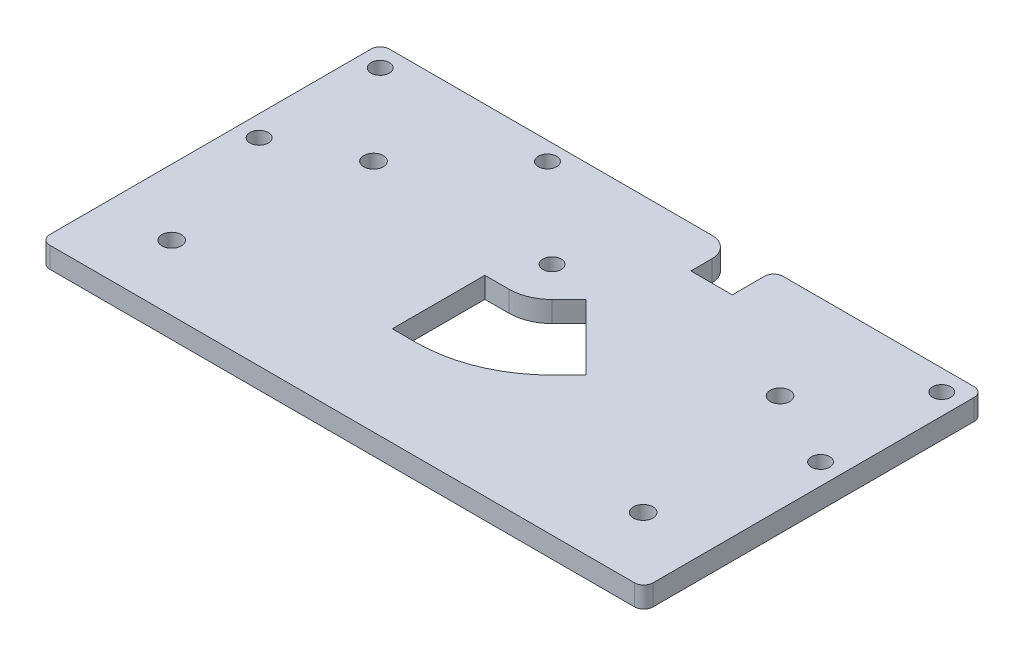
ISO-10303-21;
HEADER;
FILE_DESCRIPTION(('STEP AP214'),'2;1');
FILE_NAME('part.step','',(''),(''),'','','');
FILE_SCHEMA(('AUTOMOTIVE_DESIGN { 1 0 10303 214 1 1 1 1 }'));
ENDSEC;
DATA;
#1=APPLICATION_CONTEXT('core data for automotive mechanical design processes');
#2=APPLICATION_PROTOCOL_DEFINITION('international standard','automotive_design',2000,#1);
#3=PRODUCT_CONTEXT('',#1,'mechanical');
#4=PRODUCT('Part','Part','',(#3));
#5=PRODUCT_RELATED_PRODUCT_CATEGORY('part','',(#4));
#6=PRODUCT_DEFINITION_FORMATION('','',#4);
#7=PRODUCT_DEFINITION_CONTEXT('part definition',#1,'design');
#8=PRODUCT_DEFINITION('design','',#6,#7);
#9=PRODUCT_DEFINITION_SHAPE('','',#8);
#10=(LENGTH_UNIT() NAMED_UNIT(*) SI_UNIT(.MILLI.,.METRE.));
#11=(NAMED_UNIT(*) PLANE_ANGLE_UNIT() SI_UNIT($,.RADIAN.));
#12=(NAMED_UNIT(*) SI_UNIT($,.STERADIAN.) SOLID_ANGLE_UNIT());
#13=UNCERTAINTY_MEASURE_WITH_UNIT(LENGTH_MEASURE(1.E-05),#10,'distance_accuracy_value','');
#14=(GEOMETRIC_REPRESENTATION_CONTEXT(3) GLOBAL_UNCERTAINTY_ASSIGNED_CONTEXT((#13)) GLOBAL_UNIT_ASSIGNED_CONTEXT((#10,
#11,#12)) REPRESENTATION_CONTEXT('',''));
#15=CARTESIAN_POINT('',(0.,0.,0.));
#16=DIRECTION('',(0.,0.,1.));
#17=DIRECTION('',(1.,0.,0.));
#18=AXIS2_PLACEMENT_3D('',#15,#16,#17);
#19=CARTESIAN_POINT('',(6.51999999999997,4.5,-15.95));
#20=DIRECTION('',(0.,1.,0.));
#21=DIRECTION('',(0.,0.,1.));
#22=AXIS2_PLACEMENT_3D('',#19,#20,#21);
#23=PLANE('',#22);
#24=DIRECTION('',(0.707106781186538,0.,-0.707106781186557));
#25=VECTOR('',#24,1.);
#26=CARTESIAN_POINT('',(15.354548507695,4.5,23.0225248741374));
#27=LINE('',#26,#25);
#28=CARTESIAN_POINT('',(15.354548507695,4.5,23.0225248741374));
#29=VERTEX_POINT('',#28);
#30=CARTESIAN_POINT('',(19.0173616342414,4.5,19.359711747591));
#31=VERTEX_POINT('',#30);
#32=EDGE_CURVE('E190',#29,#31,#27,.T.);
#33=ORIENTED_EDGE('',*,*,#32,.F.);
#34=CARTESIAN_POINT('',(-5.32832484201151,4.5,2.33965152443094));
#35=DIRECTION('',(0.,1.,0.));
#36=DIRECTION('',(0.,0.,1.));
#37=AXIS2_PLACEMENT_3D('',#34,#35,#36);
#38=CIRCLE('',#37,29.25);
#39=CARTESIAN_POINT('',(-5.32832484201151,4.5,31.5896515244309));
#40=VERTEX_POINT('',#39);
#41=EDGE_CURVE('E182',#40,#29,#38,.T.);
#42=ORIENTED_EDGE('',*,*,#41,.F.);
#43=DIRECTION('',(1.,0.,0.));
#44=VECTOR('',#43,1.);
#45=CARTESIAN_POINT('',(-5.32832484201151,4.5,31.5896515244309));
#46=LINE('',#45,#44);
#47=CARTESIAN_POINT('',(-10.5083248420115,4.5,31.5896515244309));
#48=VERTEX_POINT('',#47);
#49=EDGE_CURVE('E217',#48,#40,#46,.T.);
#50=ORIENTED_EDGE('',*,*,#49,.F.);
#51=DIRECTION('',(0.000154902687349206,0.,0.999999988002579));
#52=VECTOR('',#51,1.);
#53=CARTESIAN_POINT('',(-10.5114166996881,4.5,11.6296515244309));
#54=LINE('',#53,#52);
#55=CARTESIAN_POINT('',(-10.5114166996881,4.5,11.6296515244309));
#56=VERTEX_POINT('',#55);
#57=EDGE_CURVE('E215',#56,#48,#54,.T.);
#58=ORIENTED_EDGE('',*,*,#57,.F.);
#59=DIRECTION('',(-1.,0.,0.));
#60=VECTOR('',#59,1.);
#61=CARTESIAN_POINT('',(-5.32832484201151,4.5,11.6296515244309));
#62=LINE('',#61,#60);
#63=CARTESIAN_POINT('',(-5.32832484201151,4.5,11.6296515244309));
#64=VERTEX_POINT('',#63);
#65=EDGE_CURVE('E213',#64,#56,#62,.T.);
#66=ORIENTED_EDGE('',*,*,#65,.F.);
#67=CARTESIAN_POINT('',(-5.32832484201151,4.5,2.33965152443094));
#68=DIRECTION('',(0.,-1.,0.));
#69=DIRECTION('',(0.,0.,1.));
#70=AXIS2_PLACEMENT_3D('',#67,#68,#69);
#71=CIRCLE('',#70,9.29);
#72=CARTESIAN_POINT('',(1.24069715521153,4.5,8.90867352165396));
#73=VERTEX_POINT('',#72);
#74=EDGE_CURVE('E211',#73,#64,#71,.T.);
#75=ORIENTED_EDGE('',*,*,#74,.F.);
#76=DIRECTION('',(-0.707106781186546,0.,0.707106781186549));
#77=VECTOR('',#76,1.);
#78=CARTESIAN_POINT('',(1.24069715521153,4.5,8.90867352165396));
#79=LINE('',#78,#77);
#80=CARTESIAN_POINT('',(4.90351028175794,4.5,5.24586039510753));
#81=VERTEX_POINT('',#80);
#82=EDGE_CURVE('E206',#81,#73,#79,.T.);
#83=ORIENTED_EDGE('',*,*,#82,.F.);
#84=DIRECTION('',(-0.707106781186548,0.,-0.707106781186548));
#85=VECTOR('',#84,1.);
#86=CARTESIAN_POINT('',(4.90351028175794,4.5,5.24586039510753));
#87=LINE('',#86,#85);
#88=EDGE_CURVE('E204',#31,#81,#87,.T.);
#89=ORIENTED_EDGE('',*,*,#88,.F.);
#90=EDGE_LOOP('',(#33,#42,#50,#58,#66,#75,#83,#89));
#91=FACE_BOUND('',#90,.T.);
#92=CARTESIAN_POINT('',(-43.8023,4.5,2.33965152443094));
#93=DIRECTION('',(0.,1.,0.));
#94=DIRECTION('',(0.,0.,1.));
#95=AXIS2_PLACEMENT_3D('',#92,#93,#94);
#96=CIRCLE('',#95,2.1082);
#97=CARTESIAN_POINT('',(-43.8023,4.5,4.44785152443094));
#98=VERTEX_POINT('',#97);
#99=EDGE_CURVE('E256',#98,#98,#96,.T.);
#100=ORIENTED_EDGE('',*,*,#99,.F.);
#101=EDGE_LOOP('',(#100));
#102=FACE_BOUND('',#101,.T.);
#103=CARTESIAN_POINT('',(-5.32832484201151,4.5,2.33965152443094));
#104=DIRECTION('',(0.,1.,0.));
#105=DIRECTION('',(0.,0.,1.));
#106=AXIS2_PLACEMENT_3D('',#103,#104,#105);
#107=CIRCLE('',#106,1.975);
#108=CARTESIAN_POINT('',(-5.32832484201151,4.5,4.31465152443094));
#109=VERTEX_POINT('',#108);
#110=EDGE_CURVE('E268',#109,#109,#107,.T.);
#111=ORIENTED_EDGE('',*,*,#110,.F.);
#112=EDGE_LOOP('',(#111));
#113=FACE_BOUND('',#112,.T.);
#114=CARTESIAN_POINT('',(-60.5,4.5,10.3));
#115=DIRECTION('',(0.,1.,0.));
#116=DIRECTION('',(0.,0.,-1.));
#117=AXIS2_PLACEMENT_3D('',#114,#115,#116);
#118=CIRCLE('',#117,1.975);
#119=CARTESIAN_POINT('',(-60.5,4.5,8.32500000000002));
#120=VERTEX_POINT('',#119);
#121=EDGE_CURVE('E280',#120,#120,#118,.T.);
#122=ORIENTED_EDGE('',*,*,#121,.F.);
#123=EDGE_LOOP('',(#122));
#124=FACE_BOUND('',#123,.T.);
#125=CARTESIAN_POINT('',(60.5,4.5,-15.8));
#126=DIRECTION('',(0.,1.,0.));
#127=DIRECTION('',(0.,0.,-1.));
#128=AXIS2_PLACEMENT_3D('',#125,#126,#127);
#129=CIRCLE('',#128,1.975);
#130=CARTESIAN_POINT('',(60.5,4.5,-17.775));
#131=VERTEX_POINT('',#130);
#132=EDGE_CURVE('E292',#131,#131,#129,.T.);
#133=ORIENTED_EDGE('',*,*,#132,.F.);
#134=EDGE_LOOP('',(#133));
#135=FACE_BOUND('',#134,.T.);
#136=DIRECTION('',(0.,0.,1.));
#137=VECTOR('',#136,1.);
#138=CARTESIAN_POINT('',(19.8,4.5,-18.3));
#139=LINE('',#138,#137);
#140=CARTESIAN_POINT('',(19.8,4.5,-18.3));
#141=VERTEX_POINT('',#140);
#142=CARTESIAN_POINT('',(19.8,4.5,-11.37));
#143=VERTEX_POINT('',#142);
#144=EDGE_CURVE('E304',#141,#143,#139,.T.);
#145=ORIENTED_EDGE('',*,*,#144,.T.);
#146=DIRECTION('',(-1.,0.,0.));
#147=VECTOR('',#146,1.);
#148=CARTESIAN_POINT('',(10.87,4.5,-11.37));
#149=LINE('',#148,#147);
#150=CARTESIAN_POINT('',(10.87,4.5,-11.37));
#151=VERTEX_POINT('',#150);
#152=EDGE_CURVE('E307',#143,#151,#149,.T.);
#153=ORIENTED_EDGE('',*,*,#152,.T.);
#154=DIRECTION('',(0.,0.,-1.));
#155=VECTOR('',#154,1.);
#156=CARTESIAN_POINT('',(10.87,4.5,-15.95));
#157=LINE('',#156,#155);
#158=CARTESIAN_POINT('',(10.87,4.5,-15.95));
#159=VERTEX_POINT('',#158);
#160=EDGE_CURVE('E310',#151,#159,#157,.T.);
#161=ORIENTED_EDGE('',*,*,#160,.T.);
#162=CARTESIAN_POINT('',(6.51999999999997,4.5,-15.95));
#163=DIRECTION('',(0.,1.,0.));
#164=DIRECTION('',(0.,0.,1.));
#165=AXIS2_PLACEMENT_3D('',#162,#163,#164);
#166=CIRCLE('',#165,4.35);
#167=CARTESIAN_POINT('',(6.51999999999997,4.5,-20.3));
#168=VERTEX_POINT('',#167);
#169=EDGE_CURVE('E312',#159,#168,#166,.T.);
#170=ORIENTED_EDGE('',*,*,#169,.T.);
#171=DIRECTION('',(-1.,0.,0.));
#172=VECTOR('',#171,1.);
#173=CARTESIAN_POINT('',(6.51999999999997,4.5,-20.3));
#174=LINE('',#173,#172);
#175=CARTESIAN_POINT('',(-63.,4.5,-20.3));
#176=VERTEX_POINT('',#175);
#177=EDGE_CURVE('E314',#168,#176,#174,.T.);
#178=ORIENTED_EDGE('',*,*,#177,.T.);
#179=CARTESIAN_POINT('',(-63.,4.5,-18.3));
#180=DIRECTION('',(0.,1.,0.));
#181=DIRECTION('',(0.,0.,1.));
#182=AXIS2_PLACEMENT_3D('',#179,#180,#181);
#183=CIRCLE('',#182,2.);
#184=CARTESIAN_POINT('',(-65.,4.5,-18.3));
#185=VERTEX_POINT('',#184);
#186=EDGE_CURVE('E316',#176,#185,#183,.T.);
#187=ORIENTED_EDGE('',*,*,#186,.T.);
#188=DIRECTION('',(0.,0.,1.));
#189=VECTOR('',#188,1.);
#190=CARTESIAN_POINT('',(-65.,4.5,-18.3));
#191=LINE('',#190,#189);
#192=CARTESIAN_POINT('',(-65.,4.5,50.9));
#193=VERTEX_POINT('',#192);
#194=EDGE_CURVE('E318',#185,#193,#191,.T.);
#195=ORIENTED_EDGE('',*,*,#194,.T.);
#196=CARTESIAN_POINT('',(-63.,4.5,50.9));
#197=DIRECTION('',(0.,1.,0.));
#198=DIRECTION('',(0.,0.,-1.));
#199=AXIS2_PLACEMENT_3D('',#196,#197,#198);
#200=CIRCLE('',#199,2.);
#201=CARTESIAN_POINT('',(-63.,4.5,52.9));
#202=VERTEX_POINT('',#201);
#203=EDGE_CURVE('E320',#193,#202,#200,.T.);
#204=ORIENTED_EDGE('',*,*,#203,.T.);
#205=DIRECTION('',(1.,0.,0.));
#206=VECTOR('',#205,1.);
#207=CARTESIAN_POINT('',(63.,4.5,52.8999999999999));
#208=LINE('',#207,#206);
#209=CARTESIAN_POINT('',(63.,4.5,52.8999999999999));
#210=VERTEX_POINT('',#209);
#211=EDGE_CURVE('E322',#202,#210,#208,.T.);
#212=ORIENTED_EDGE('',*,*,#211,.T.);
#213=CARTESIAN_POINT('',(63.,4.5,50.8999999999999));
#214=DIRECTION('',(0.,1.,0.));
#215=DIRECTION('',(0.,0.,-1.));
#216=AXIS2_PLACEMENT_3D('',#213,#214,#215);
#217=CIRCLE('',#216,2.);
#218=CARTESIAN_POINT('',(65.,4.5,50.8999999999999));
#219=VERTEX_POINT('',#218);
#220=EDGE_CURVE('E324',#210,#219,#217,.T.);
#221=ORIENTED_EDGE('',*,*,#220,.T.);
#222=DIRECTION('',(0.,0.,-1.));
#223=VECTOR('',#222,1.);
#224=CARTESIAN_POINT('',(65.,4.5,-18.3));
#225=LINE('',#224,#223);
#226=CARTESIAN_POINT('',(65.,4.5,-18.3));
#227=VERTEX_POINT('',#226);
#228=EDGE_CURVE('E326',#219,#227,#225,.T.);
#229=ORIENTED_EDGE('',*,*,#228,.T.);
#230=CARTESIAN_POINT('',(63.,4.5,-18.3));
#231=DIRECTION('',(0.,1.,0.));
#232=DIRECTION('',(0.,0.,-1.));
#233=AXIS2_PLACEMENT_3D('',#230,#231,#232);
#234=CIRCLE('',#233,2.);
#235=CARTESIAN_POINT('',(63.,4.5,-20.3));
#236=VERTEX_POINT('',#235);
#237=EDGE_CURVE('E328',#227,#236,#234,.T.);
#238=ORIENTED_EDGE('',*,*,#237,.T.);
#239=DIRECTION('',(-1.,0.,0.));
#240=VECTOR('',#239,1.);
#241=CARTESIAN_POINT('',(63.,4.5,-20.3));
#242=LINE('',#241,#240);
#243=CARTESIAN_POINT('',(21.8,4.5,-20.3));
#244=VERTEX_POINT('',#243);
#245=EDGE_CURVE('E330',#236,#244,#242,.T.);
#246=ORIENTED_EDGE('',*,*,#245,.T.);
#247=CARTESIAN_POINT('',(21.8,4.5,-18.3));
#248=DIRECTION('',(0.,1.,0.));
#249=DIRECTION('',(0.,0.,1.));
#250=AXIS2_PLACEMENT_3D('',#247,#248,#249);
#251=CIRCLE('',#250,2.00000000000002);
#252=EDGE_CURVE('E332',#244,#141,#251,.T.);
#253=ORIENTED_EDGE('',*,*,#252,.T.);
#254=EDGE_LOOP('',(#145,#153,#161,#170,#178,#187,#195,#204,#212,#221,#229,#238,#246,#253));
#255=FACE_BOUND('',#254,.T.);
#256=CARTESIAN_POINT('',(-60.5,4.5,-15.8));
#257=DIRECTION('',(0.,1.,0.));
#258=DIRECTION('',(0.,0.,1.));
#259=AXIS2_PLACEMENT_3D('',#256,#257,#258);
#260=CIRCLE('',#259,1.97499999999998);
#261=CARTESIAN_POINT('',(-60.5,4.5,-13.825));
#262=VERTEX_POINT('',#261);
#263=EDGE_CURVE('E298',#262,#262,#260,.T.);
#264=ORIENTED_EDGE('',*,*,#263,.F.);
#265=EDGE_LOOP('',(#264));
#266=FACE_BOUND('',#265,.T.);
#267=CARTESIAN_POINT('',(60.5,4.5,10.3));
#268=DIRECTION('',(0.,1.,0.));
#269=DIRECTION('',(0.,0.,1.));
#270=AXIS2_PLACEMENT_3D('',#267,#268,#269);
#271=CIRCLE('',#270,1.975);
#272=CARTESIAN_POINT('',(60.5,4.5,12.275));
#273=VERTEX_POINT('',#272);
#274=EDGE_CURVE('E286',#273,#273,#271,.T.);
#275=ORIENTED_EDGE('',*,*,#274,.F.);
#276=EDGE_LOOP('',(#275));
#277=FACE_BOUND('',#276,.T.);
#278=CARTESIAN_POINT('',(-25.0042608190786,4.5,-16.35));
#279=DIRECTION('',(0.,1.,0.));
#280=DIRECTION('',(0.,0.,1.));
#281=AXIS2_PLACEMENT_3D('',#278,#279,#280);
#282=CIRCLE('',#281,1.97499999999998);
#283=CARTESIAN_POINT('',(-25.0042608190786,4.5,-14.375));
#284=VERTEX_POINT('',#283);
#285=EDGE_CURVE('E274',#284,#284,#282,.T.);
#286=ORIENTED_EDGE('',*,*,#285,.F.);
#287=EDGE_LOOP('',(#286));
#288=FACE_BOUND('',#287,.T.);
#289=CARTESIAN_POINT('',(-50.8,4.5,38.838722529222));
#290=DIRECTION('',(0.,1.,0.));
#291=DIRECTION('',(0.,0.,1.));
#292=AXIS2_PLACEMENT_3D('',#289,#290,#291);
#293=CIRCLE('',#292,2.10819999999999);
#294=CARTESIAN_POINT('',(-50.8,4.5,40.946922529222));
#295=VERTEX_POINT('',#294);
#296=EDGE_CURVE('E262',#295,#295,#293,.T.);
#297=ORIENTED_EDGE('',*,*,#296,.F.);
#298=EDGE_LOOP('',(#297));
#299=FACE_BOUND('',#298,.T.);
#300=CARTESIAN_POINT('',(43.8023,4.5,2.33965152443093));
#301=DIRECTION('',(0.,1.,0.));
#302=DIRECTION('',(0.,0.,-1.));
#303=AXIS2_PLACEMENT_3D('',#300,#301,#302);
#304=CIRCLE('',#303,2.1082);
#305=CARTESIAN_POINT('',(43.8023,4.5,0.231451524430932));
#306=VERTEX_POINT('',#305);
#307=EDGE_CURVE('E250',#306,#306,#304,.T.);
#308=ORIENTED_EDGE('',*,*,#307,.F.);
#309=EDGE_LOOP('',(#308));
#310=FACE_BOUND('',#309,.T.);
#311=CARTESIAN_POINT('',(50.8,4.5,38.838722529222));
#312=DIRECTION('',(0.,1.,0.));
#313=DIRECTION('',(0.,0.,-1.));
#314=AXIS2_PLACEMENT_3D('',#311,#312,#313);
#315=CIRCLE('',#314,2.10819999999999);
#316=CARTESIAN_POINT('',(50.8,4.5,36.730522529222));
#317=VERTEX_POINT('',#316);
#318=EDGE_CURVE('E220',#317,#317,#315,.T.);
#319=ORIENTED_EDGE('',*,*,#318,.F.);
#320=EDGE_LOOP('',(#319));
#321=FACE_BOUND('',#320,.T.);
#322=ADVANCED_FACE('F33',(#91,#102,#113,#124,#135,#255,#266,#277,#288,#299,#310,#321),#23,.T.);
#323=CARTESIAN_POINT('',(6.51999999999997,0.,-15.95));
#324=DIRECTION('',(0.,1.,0.));
#325=DIRECTION('',(0.,0.,1.));
#326=AXIS2_PLACEMENT_3D('',#323,#324,#325);
#327=PLANE('',#326);
#328=CARTESIAN_POINT('',(-5.32832484201151,0.,2.33965152443094));
#329=DIRECTION('',(0.,1.,0.));
#330=DIRECTION('',(0.,0.,1.));
#331=AXIS2_PLACEMENT_3D('',#328,#329,#330);
#332=CIRCLE('',#331,29.25);
#333=CARTESIAN_POINT('',(-5.32832484201151,0.,31.5896515244309));
#334=VERTEX_POINT('',#333);
#335=CARTESIAN_POINT('',(15.354548507695,0.,23.0225248741374));
#336=VERTEX_POINT('',#335);
#337=EDGE_CURVE('E56',#334,#336,#332,.T.);
#338=ORIENTED_EDGE('',*,*,#337,.T.);
#339=DIRECTION('',(0.707106781186538,0.,-0.707106781186557));
#340=VECTOR('',#339,1.);
#341=CARTESIAN_POINT('',(15.354548507695,0.,23.0225248741374));
#342=LINE('',#341,#340);
#343=CARTESIAN_POINT('',(19.0173616342414,0.,19.359711747591));
#344=VERTEX_POINT('',#343);
#345=EDGE_CURVE('E197',#336,#344,#342,.T.);
#346=ORIENTED_EDGE('',*,*,#345,.T.);
#347=DIRECTION('',(-0.707106781186548,0.,-0.707106781186548));
#348=VECTOR('',#347,1.);
#349=CARTESIAN_POINT('',(4.90351028175794,0.,5.24586039510753));
#350=LINE('',#349,#348);
#351=CARTESIAN_POINT('',(4.90351028175794,0.,5.24586039510753));
#352=VERTEX_POINT('',#351);
#353=EDGE_CURVE('E222',#344,#352,#350,.T.);
#354=ORIENTED_EDGE('',*,*,#353,.T.);
#355=DIRECTION('',(-0.707106781186546,0.,0.707106781186549));
#356=VECTOR('',#355,1.);
#357=CARTESIAN_POINT('',(1.24069715521153,0.,8.90867352165396));
#358=LINE('',#357,#356);
#359=CARTESIAN_POINT('',(1.24069715521153,0.,8.90867352165396));
#360=VERTEX_POINT('',#359);
#361=EDGE_CURVE('E225',#352,#360,#358,.T.);
#362=ORIENTED_EDGE('',*,*,#361,.T.);
#363=CARTESIAN_POINT('',(-5.32832484201151,0.,2.33965152443094));
#364=DIRECTION('',(0.,-1.,0.));
#365=DIRECTION('',(0.,0.,1.));
#366=AXIS2_PLACEMENT_3D('',#363,#364,#365);
#367=CIRCLE('',#366,9.29);
#368=CARTESIAN_POINT('',(-5.32832484201151,0.,11.6296515244309));
#369=VERTEX_POINT('',#368);
#370=EDGE_CURVE('E228',#360,#369,#367,.T.);
#371=ORIENTED_EDGE('',*,*,#370,.T.);
#372=DIRECTION('',(-1.,0.,0.));
#373=VECTOR('',#372,1.);
#374=CARTESIAN_POINT('',(-5.32832484201151,0.,11.6296515244309));
#375=LINE('',#374,#373);
#376=CARTESIAN_POINT('',(-10.5114166996881,0.,11.6296515244309));
#377=VERTEX_POINT('',#376);
#378=EDGE_CURVE('E231',#369,#377,#375,.T.);
#379=ORIENTED_EDGE('',*,*,#378,.T.);
#380=DIRECTION('',(0.000154902687349206,0.,0.999999988002579));
#381=VECTOR('',#380,1.);
#382=CARTESIAN_POINT('',(-10.5114166996881,0.,11.6296515244309));
#383=LINE('',#382,#381);
#384=CARTESIAN_POINT('',(-10.5083248420115,0.,31.5896515244309));
#385=VERTEX_POINT('',#384);
#386=EDGE_CURVE('E234',#377,#385,#383,.T.);
#387=ORIENTED_EDGE('',*,*,#386,.T.);
#388=DIRECTION('',(1.,0.,0.));
#389=VECTOR('',#388,1.);
#390=CARTESIAN_POINT('',(-5.32832484201151,0.,31.5896515244309));
#391=LINE('',#390,#389);
#392=EDGE_CURVE('E191',#385,#334,#391,.T.);
#393=ORIENTED_EDGE('',*,*,#392,.T.);
#394=EDGE_LOOP('',(#338,#346,#354,#362,#371,#379,#387,#393));
#395=FACE_BOUND('',#394,.T.);
#396=CARTESIAN_POINT('',(-43.8023,0.,2.33965152443094));
#397=DIRECTION('',(0.,1.,0.));
#398=DIRECTION('',(0.,0.,1.));
#399=AXIS2_PLACEMENT_3D('',#396,#397,#398);
#400=CIRCLE('',#399,2.1082);
#401=CARTESIAN_POINT('',(-43.8023,0.,4.44785152443094));
#402=VERTEX_POINT('',#401);
#403=EDGE_CURVE('E253',#402,#402,#400,.T.);
#404=ORIENTED_EDGE('',*,*,#403,.T.);
#405=EDGE_LOOP('',(#404));
#406=FACE_BOUND('',#405,.T.);
#407=CARTESIAN_POINT('',(-5.32832484201151,0.,2.33965152443094));
#408=DIRECTION('',(0.,1.,0.));
#409=DIRECTION('',(0.,0.,1.));
#410=AXIS2_PLACEMENT_3D('',#407,#408,#409);
#411=CIRCLE('',#410,1.975);
#412=CARTESIAN_POINT('',(-5.32832484201151,0.,4.31465152443094));
#413=VERTEX_POINT('',#412);
#414=EDGE_CURVE('E265',#413,#413,#411,.T.);
#415=ORIENTED_EDGE('',*,*,#414,.T.);
#416=EDGE_LOOP('',(#415));
#417=FACE_BOUND('',#416,.T.);
#418=CARTESIAN_POINT('',(-60.5,0.,10.3));
#419=DIRECTION('',(0.,1.,0.));
#420=DIRECTION('',(0.,0.,-1.));
#421=AXIS2_PLACEMENT_3D('',#418,#419,#420);
#422=CIRCLE('',#421,1.975);
#423=CARTESIAN_POINT('',(-60.5,0.,8.32500000000002));
#424=VERTEX_POINT('',#423);
#425=EDGE_CURVE('E277',#424,#424,#422,.T.);
#426=ORIENTED_EDGE('',*,*,#425,.T.);
#427=EDGE_LOOP('',(#426));
#428=FACE_BOUND('',#427,.T.);
#429=CARTESIAN_POINT('',(60.5,0.,-15.8));
#430=DIRECTION('',(0.,1.,0.));
#431=DIRECTION('',(0.,0.,-1.));
#432=AXIS2_PLACEMENT_3D('',#429,#430,#431);
#433=CIRCLE('',#432,1.975);
#434=CARTESIAN_POINT('',(60.5,0.,-17.775));
#435=VERTEX_POINT('',#434);
#436=EDGE_CURVE('E289',#435,#435,#433,.T.);
#437=ORIENTED_EDGE('',*,*,#436,.T.);
#438=EDGE_LOOP('',(#437));
#439=FACE_BOUND('',#438,.T.);
#440=DIRECTION('',(0.,0.,1.));
#441=VECTOR('',#440,1.);
#442=CARTESIAN_POINT('',(19.8,0.,-18.3));
#443=LINE('',#442,#441);
#444=CARTESIAN_POINT('',(19.8,0.,-18.3));
#445=VERTEX_POINT('',#444);
#446=CARTESIAN_POINT('',(19.8,0.,-11.37));
#447=VERTEX_POINT('',#446);
#448=EDGE_CURVE('E301',#445,#447,#443,.T.);
#449=ORIENTED_EDGE('',*,*,#448,.F.);
#450=CARTESIAN_POINT('',(21.8,0.,-18.3));
#451=DIRECTION('',(0.,1.,0.));
#452=DIRECTION('',(0.,0.,1.));
#453=AXIS2_PLACEMENT_3D('',#450,#451,#452);
#454=CIRCLE('',#453,2.00000000000002);
#455=CARTESIAN_POINT('',(21.8,0.,-20.3));
#456=VERTEX_POINT('',#455);
#457=EDGE_CURVE('E308',#456,#445,#454,.T.);
#458=ORIENTED_EDGE('',*,*,#457,.F.);
#459=DIRECTION('',(-1.,0.,0.));
#460=VECTOR('',#459,1.);
#461=CARTESIAN_POINT('',(63.,0.,-20.3));
#462=LINE('',#461,#460);
#463=CARTESIAN_POINT('',(63.,0.,-20.3));
#464=VERTEX_POINT('',#463);
#465=EDGE_CURVE('E359',#464,#456,#462,.T.);
#466=ORIENTED_EDGE('',*,*,#465,.F.);
#467=CARTESIAN_POINT('',(63.,0.,-18.3));
#468=DIRECTION('',(0.,1.,0.));
#469=DIRECTION('',(0.,0.,-1.));
#470=AXIS2_PLACEMENT_3D('',#467,#468,#469);
#471=CIRCLE('',#470,2.);
#472=CARTESIAN_POINT('',(65.,0.,-18.3));
#473=VERTEX_POINT('',#472);
#474=EDGE_CURVE('E357',#473,#464,#471,.T.);
#475=ORIENTED_EDGE('',*,*,#474,.F.);
#476=DIRECTION('',(0.,0.,-1.));
#477=VECTOR('',#476,1.);
#478=CARTESIAN_POINT('',(65.,0.,-18.3));
#479=LINE('',#478,#477);
#480=CARTESIAN_POINT('',(65.,0.,50.8999999999999));
#481=VERTEX_POINT('',#480);
#482=EDGE_CURVE('E355',#481,#473,#479,.T.);
#483=ORIENTED_EDGE('',*,*,#482,.F.);
#484=CARTESIAN_POINT('',(63.,0.,50.8999999999999));
#485=DIRECTION('',(0.,1.,0.));
#486=DIRECTION('',(0.,0.,-1.));
#487=AXIS2_PLACEMENT_3D('',#484,#485,#486);
#488=CIRCLE('',#487,2.);
#489=CARTESIAN_POINT('',(63.,0.,52.8999999999999));
#490=VERTEX_POINT('',#489);
#491=EDGE_CURVE('E353',#490,#481,#488,.T.);
#492=ORIENTED_EDGE('',*,*,#491,.F.);
#493=DIRECTION('',(1.,0.,0.));
#494=VECTOR('',#493,1.);
#495=CARTESIAN_POINT('',(63.,0.,52.8999999999999));
#496=LINE('',#495,#494);
#497=CARTESIAN_POINT('',(-63.,0.,52.9));
#498=VERTEX_POINT('',#497);
#499=EDGE_CURVE('E351',#498,#490,#496,.T.);
#500=ORIENTED_EDGE('',*,*,#499,.F.);
#501=CARTESIAN_POINT('',(-63.,0.,50.9));
#502=DIRECTION('',(0.,1.,0.));
#503=DIRECTION('',(0.,0.,-1.));
#504=AXIS2_PLACEMENT_3D('',#501,#502,#503);
#505=CIRCLE('',#504,2.);
#506=CARTESIAN_POINT('',(-65.,0.,50.9));
#507=VERTEX_POINT('',#506);
#508=EDGE_CURVE('E349',#507,#498,#505,.T.);
#509=ORIENTED_EDGE('',*,*,#508,.F.);
#510=DIRECTION('',(0.,0.,1.));
#511=VECTOR('',#510,1.);
#512=CARTESIAN_POINT('',(-65.,0.,-18.3));
#513=LINE('',#512,#511);
#514=CARTESIAN_POINT('',(-65.,0.,-18.3));
#515=VERTEX_POINT('',#514);
#516=EDGE_CURVE('E347',#515,#507,#513,.T.);
#517=ORIENTED_EDGE('',*,*,#516,.F.);
#518=CARTESIAN_POINT('',(-63.,0.,-18.3));
#519=DIRECTION('',(0.,1.,0.));
#520=DIRECTION('',(0.,0.,1.));
#521=AXIS2_PLACEMENT_3D('',#518,#519,#520);
#522=CIRCLE('',#521,2.);
#523=CARTESIAN_POINT('',(-63.,0.,-20.3));
#524=VERTEX_POINT('',#523);
#525=EDGE_CURVE('E345',#524,#515,#522,.T.);
#526=ORIENTED_EDGE('',*,*,#525,.F.);
#527=DIRECTION('',(-1.,0.,0.));
#528=VECTOR('',#527,1.);
#529=CARTESIAN_POINT('',(6.51999999999997,0.,-20.3));
#530=LINE('',#529,#528);
#531=CARTESIAN_POINT('',(6.51999999999997,0.,-20.3));
#532=VERTEX_POINT('',#531);
#533=EDGE_CURVE('E343',#532,#524,#530,.T.);
#534=ORIENTED_EDGE('',*,*,#533,.F.);
#535=CARTESIAN_POINT('',(6.51999999999997,0.,-15.95));
#536=DIRECTION('',(0.,1.,0.));
#537=DIRECTION('',(0.,0.,1.));
#538=AXIS2_PLACEMENT_3D('',#535,#536,#537);
#539=CIRCLE('',#538,4.35);
#540=CARTESIAN_POINT('',(10.87,0.,-15.95));
#541=VERTEX_POINT('',#540);
#542=EDGE_CURVE('E341',#541,#532,#539,.T.);
#543=ORIENTED_EDGE('',*,*,#542,.F.);
#544=DIRECTION('',(0.,0.,-1.));
#545=VECTOR('',#544,1.);
#546=CARTESIAN_POINT('',(10.87,0.,-15.95));
#547=LINE('',#546,#545);
#548=CARTESIAN_POINT('',(10.87,0.,-11.37));
#549=VERTEX_POINT('',#548);
#550=EDGE_CURVE('E339',#549,#541,#547,.T.);
#551=ORIENTED_EDGE('',*,*,#550,.F.);
#552=DIRECTION('',(-1.,0.,0.));
#553=VECTOR('',#552,1.);
#554=CARTESIAN_POINT('',(10.87,0.,-11.37));
#555=LINE('',#554,#553);
#556=EDGE_CURVE('E337',#447,#549,#555,.T.);
#557=ORIENTED_EDGE('',*,*,#556,.F.);
#558=EDGE_LOOP('',(#449,#458,#466,#475,#483,#492,#500,#509,#517,#526,#534,#543,#551,#557));
#559=FACE_BOUND('',#558,.T.);
#560=CARTESIAN_POINT('',(-60.5,0.,-15.8));
#561=DIRECTION('',(0.,1.,0.));
#562=DIRECTION('',(0.,0.,1.));
#563=AXIS2_PLACEMENT_3D('',#560,#561,#562);
#564=CIRCLE('',#563,1.97499999999998);
#565=CARTESIAN_POINT('',(-60.5,0.,-13.825));
#566=VERTEX_POINT('',#565);
#567=EDGE_CURVE('E295',#566,#566,#564,.T.);
#568=ORIENTED_EDGE('',*,*,#567,.T.);
#569=EDGE_LOOP('',(#568));
#570=FACE_BOUND('',#569,.T.);
#571=CARTESIAN_POINT('',(60.5,0.,10.3));
#572=DIRECTION('',(0.,1.,0.));
#573=DIRECTION('',(0.,0.,1.));
#574=AXIS2_PLACEMENT_3D('',#571,#572,#573);
#575=CIRCLE('',#574,1.975);
#576=CARTESIAN_POINT('',(60.5,0.,12.275));
#577=VERTEX_POINT('',#576);
#578=EDGE_CURVE('E283',#577,#577,#575,.T.);
#579=ORIENTED_EDGE('',*,*,#578,.T.);
#580=EDGE_LOOP('',(#579));
#581=FACE_BOUND('',#580,.T.);
#582=CARTESIAN_POINT('',(-25.0042608190786,0.,-16.35));
#583=DIRECTION('',(0.,1.,0.));
#584=DIRECTION('',(0.,0.,1.));
#585=AXIS2_PLACEMENT_3D('',#582,#583,#584);
#586=CIRCLE('',#585,1.97499999999998);
#587=CARTESIAN_POINT('',(-25.0042608190786,0.,-14.375));
#588=VERTEX_POINT('',#587);
#589=EDGE_CURVE('E271',#588,#588,#586,.T.);
#590=ORIENTED_EDGE('',*,*,#589,.T.);
#591=EDGE_LOOP('',(#590));
#592=FACE_BOUND('',#591,.T.);
#593=CARTESIAN_POINT('',(-50.8,0.,38.838722529222));
#594=DIRECTION('',(0.,1.,0.));
#595=DIRECTION('',(0.,0.,1.));
#596=AXIS2_PLACEMENT_3D('',#593,#594,#595);
#597=CIRCLE('',#596,2.10819999999999);
#598=CARTESIAN_POINT('',(-50.8,0.,40.946922529222));
#599=VERTEX_POINT('',#598);
#600=EDGE_CURVE('E259',#599,#599,#597,.T.);
#601=ORIENTED_EDGE('',*,*,#600,.T.);
#602=EDGE_LOOP('',(#601));
#603=FACE_BOUND('',#602,.T.);
#604=CARTESIAN_POINT('',(43.8023,0.,2.33965152443093));
#605=DIRECTION('',(0.,1.,0.));
#606=DIRECTION('',(0.,0.,-1.));
#607=AXIS2_PLACEMENT_3D('',#604,#605,#606);
#608=CIRCLE('',#607,2.1082);
#609=CARTESIAN_POINT('',(43.8023,0.,0.231451524430932));
#610=VERTEX_POINT('',#609);
#611=EDGE_CURVE('E198',#610,#610,#608,.T.);
#612=ORIENTED_EDGE('',*,*,#611,.T.);
#613=EDGE_LOOP('',(#612));
#614=FACE_BOUND('',#613,.T.);
#615=CARTESIAN_POINT('',(50.8,0.,38.838722529222));
#616=DIRECTION('',(0.,1.,0.));
#617=DIRECTION('',(0.,0.,-1.));
#618=AXIS2_PLACEMENT_3D('',#615,#616,#617);
#619=CIRCLE('',#618,2.10819999999999);
#620=CARTESIAN_POINT('',(50.8,0.,36.730522529222));
#621=VERTEX_POINT('',#620);
#622=EDGE_CURVE('E776',#621,#621,#619,.T.);
#623=ORIENTED_EDGE('',*,*,#622,.T.);
#624=EDGE_LOOP('',(#623));
#625=FACE_BOUND('',#624,.T.);
#626=ADVANCED_FACE('F407',(#395,#406,#417,#428,#439,#559,#570,#581,#592,#603,#614,#625),#327,.F.);
#627=CARTESIAN_POINT('',(19.8,4.5,-18.3));
#628=DIRECTION('',(1.,0.,0.));
#629=DIRECTION('',(0.,0.,-1.));
#630=AXIS2_PLACEMENT_3D('',#627,#628,#629);
#631=PLANE('',#630);
#632=ORIENTED_EDGE('',*,*,#448,.T.);
#633=DIRECTION('',(0.,-1.,0.));
#634=VECTOR('',#633,1.);
#635=CARTESIAN_POINT('',(19.8,4.5,-11.37));
#636=LINE('',#635,#634);
#637=EDGE_CURVE('E11',#143,#447,#636,.T.);
#638=ORIENTED_EDGE('',*,*,#637,.F.);
#639=ORIENTED_EDGE('',*,*,#144,.F.);
#640=DIRECTION('',(0.,-1.,0.));
#641=VECTOR('',#640,1.);
#642=CARTESIAN_POINT('',(19.8,4.5,-18.3));
#643=LINE('',#642,#641);
#644=EDGE_CURVE('E334',#141,#445,#643,.T.);
#645=ORIENTED_EDGE('',*,*,#644,.T.);
#646=EDGE_LOOP('',(#632,#638,#639,#645));
#647=FACE_BOUND('',#646,.T.);
#648=ADVANCED_FACE('F35',(#647),#631,.F.);
#649=CARTESIAN_POINT('',(10.87,4.5,-11.37));
#650=DIRECTION('',(0.,0.,1.));
#651=DIRECTION('',(1.,0.,0.));
#652=AXIS2_PLACEMENT_3D('',#649,#650,#651);
#653=PLANE('',#652);
#654=ORIENTED_EDGE('',*,*,#556,.T.);
#655=DIRECTION('',(0.,-1.,0.));
#656=VECTOR('',#655,1.);
#657=CARTESIAN_POINT('',(10.87,4.5,-11.37));
#658=LINE('',#657,#656);
#659=EDGE_CURVE('E41',#151,#549,#658,.T.);
#660=ORIENTED_EDGE('',*,*,#659,.F.);
#661=ORIENTED_EDGE('',*,*,#152,.F.);
#662=ORIENTED_EDGE('',*,*,#637,.T.);
#663=EDGE_LOOP('',(#654,#660,#661,#662));
#664=FACE_BOUND('',#663,.T.);
#665=ADVANCED_FACE('F425',(#664),#653,.F.);
#666=CARTESIAN_POINT('',(10.87,4.5,-15.95));
#667=DIRECTION('',(-1.,0.,0.));
#668=DIRECTION('',(0.,0.,1.));
#669=AXIS2_PLACEMENT_3D('',#666,#667,#668);
#670=PLANE('',#669);
#671=ORIENTED_EDGE('',*,*,#550,.T.);
#672=DIRECTION('',(0.,-1.,0.));
#673=VECTOR('',#672,1.);
#674=CARTESIAN_POINT('',(10.87,4.5,-15.95));
#675=LINE('',#674,#673);
#676=EDGE_CURVE('E394',#159,#541,#675,.T.);
#677=ORIENTED_EDGE('',*,*,#676,.F.);
#678=ORIENTED_EDGE('',*,*,#160,.F.);
#679=ORIENTED_EDGE('',*,*,#659,.T.);
#680=EDGE_LOOP('',(#671,#677,#678,#679));
#681=FACE_BOUND('',#680,.T.);
#682=ADVANCED_FACE('F401',(#681),#670,.F.);
#683=CARTESIAN_POINT('',(6.51999999999997,4.5,-15.95));
#684=DIRECTION('',(0.,-1.,0.));
#685=DIRECTION('',(0.,0.,-1.));
#686=AXIS2_PLACEMENT_3D('',#683,#684,#685);
#687=CYLINDRICAL_SURFACE('',#686,4.35);
#688=ORIENTED_EDGE('',*,*,#542,.T.);
#689=DIRECTION('',(0.,-1.,0.));
#690=VECTOR('',#689,1.);
#691=CARTESIAN_POINT('',(6.51999999999997,4.5,-20.3));
#692=LINE('',#691,#690);
#693=EDGE_CURVE('E391',#168,#532,#692,.T.);
#694=ORIENTED_EDGE('',*,*,#693,.F.);
#695=ORIENTED_EDGE('',*,*,#169,.F.);
#696=ORIENTED_EDGE('',*,*,#676,.T.);
#697=EDGE_LOOP('',(#688,#694,#695,#696));
#698=FACE_BOUND('',#697,.T.);
#699=ADVANCED_FACE('F413',(#698),#687,.T.);
#700=CARTESIAN_POINT('',(6.51999999999997,4.5,-20.3));
#701=DIRECTION('',(0.,0.,1.));
#702=DIRECTION('',(1.,0.,0.));
#703=AXIS2_PLACEMENT_3D('',#700,#701,#702);
#704=PLANE('',#703);
#705=ORIENTED_EDGE('',*,*,#533,.T.);
#706=DIRECTION('',(0.,-1.,0.));
#707=VECTOR('',#706,1.);
#708=CARTESIAN_POINT('',(-63.,4.5,-20.3));
#709=LINE('',#708,#707);
#710=EDGE_CURVE('E388',#176,#524,#709,.T.);
#711=ORIENTED_EDGE('',*,*,#710,.F.);
#712=ORIENTED_EDGE('',*,*,#177,.F.);
#713=ORIENTED_EDGE('',*,*,#693,.T.);
#714=EDGE_LOOP('',(#705,#711,#712,#713));
#715=FACE_BOUND('',#714,.T.);
#716=ADVANCED_FACE('F417',(#715),#704,.F.);
#717=CARTESIAN_POINT('',(-63.,4.5,-18.3));
#718=DIRECTION('',(0.,-1.,0.));
#719=DIRECTION('',(0.,0.,-1.));
#720=AXIS2_PLACEMENT_3D('',#717,#718,#719);
#721=CYLINDRICAL_SURFACE('',#720,2.);
#722=ORIENTED_EDGE('',*,*,#525,.T.);
#723=DIRECTION('',(0.,-1.,0.));
#724=VECTOR('',#723,1.);
#725=CARTESIAN_POINT('',(-65.,4.5,-18.3));
#726=LINE('',#725,#724);
#727=EDGE_CURVE('E385',#185,#515,#726,.T.);
#728=ORIENTED_EDGE('',*,*,#727,.F.);
#729=ORIENTED_EDGE('',*,*,#186,.F.);
#730=ORIENTED_EDGE('',*,*,#710,.T.);
#731=EDGE_LOOP('',(#722,#728,#729,#730));
#732=FACE_BOUND('',#731,.T.);
#733=ADVANCED_FACE('F468',(#732),#721,.T.);
#734=CARTESIAN_POINT('',(-65.,4.5,-18.3));
#735=DIRECTION('',(1.,0.,0.));
#736=DIRECTION('',(0.,0.,-1.));
#737=AXIS2_PLACEMENT_3D('',#734,#735,#736);
#738=PLANE('',#737);
#739=ORIENTED_EDGE('',*,*,#516,.T.);
#740=DIRECTION('',(0.,-1.,0.));
#741=VECTOR('',#740,1.);
#742=CARTESIAN_POINT('',(-65.,4.5,50.9));
#743=LINE('',#742,#741);
#744=EDGE_CURVE('E382',#193,#507,#743,.T.);
#745=ORIENTED_EDGE('',*,*,#744,.F.);
#746=ORIENTED_EDGE('',*,*,#194,.F.);
#747=ORIENTED_EDGE('',*,*,#727,.T.);
#748=EDGE_LOOP('',(#739,#745,#746,#747));
#749=FACE_BOUND('',#748,.T.);
#750=ADVANCED_FACE('F466',(#749),#738,.F.);
#751=CARTESIAN_POINT('',(-63.,4.5,50.9));
#752=DIRECTION('',(0.,-1.,0.));
#753=DIRECTION('',(0.,0.,-1.));
#754=AXIS2_PLACEMENT_3D('',#751,#752,#753);
#755=CYLINDRICAL_SURFACE('',#754,2.);
#756=ORIENTED_EDGE('',*,*,#508,.T.);
#757=DIRECTION('',(0.,-1.,0.));
#758=VECTOR('',#757,1.);
#759=CARTESIAN_POINT('',(-63.,4.5,52.9));
#760=LINE('',#759,#758);
#761=EDGE_CURVE('E379',#202,#498,#760,.T.);
#762=ORIENTED_EDGE('',*,*,#761,.F.);
#763=ORIENTED_EDGE('',*,*,#203,.F.);
#764=ORIENTED_EDGE('',*,*,#744,.T.);
#765=EDGE_LOOP('',(#756,#762,#763,#764));
#766=FACE_BOUND('',#765,.T.);
#767=ADVANCED_FACE('F461',(#766),#755,.T.);
#768=CARTESIAN_POINT('',(63.,4.5,52.8999999999999));
#769=DIRECTION('',(0.,0.,-1.));
#770=DIRECTION('',(-1.,0.,0.));
#771=AXIS2_PLACEMENT_3D('',#768,#769,#770);
#772=PLANE('',#771);
#773=ORIENTED_EDGE('',*,*,#499,.T.);
#774=DIRECTION('',(0.,-1.,0.));
#775=VECTOR('',#774,1.);
#776=CARTESIAN_POINT('',(63.,4.5,52.8999999999999));
#777=LINE('',#776,#775);
#778=EDGE_CURVE('E376',#210,#490,#777,.T.);
#779=ORIENTED_EDGE('',*,*,#778,.F.);
#780=ORIENTED_EDGE('',*,*,#211,.F.);
#781=ORIENTED_EDGE('',*,*,#761,.T.);
#782=EDGE_LOOP('',(#773,#779,#780,#781));
#783=FACE_BOUND('',#782,.T.);
#784=ADVANCED_FACE('F456',(#783),#772,.F.);
#785=CARTESIAN_POINT('',(63.,4.5,50.8999999999999));
#786=DIRECTION('',(0.,-1.,0.));
#787=DIRECTION('',(0.,0.,-1.));
#788=AXIS2_PLACEMENT_3D('',#785,#786,#787);
#789=CYLINDRICAL_SURFACE('',#788,2.);
#790=ORIENTED_EDGE('',*,*,#491,.T.);
#791=DIRECTION('',(0.,-1.,0.));
#792=VECTOR('',#791,1.);
#793=CARTESIAN_POINT('',(65.,4.5,50.8999999999999));
#794=LINE('',#793,#792);
#795=EDGE_CURVE('E373',#219,#481,#794,.T.);
#796=ORIENTED_EDGE('',*,*,#795,.F.);
#797=ORIENTED_EDGE('',*,*,#220,.F.);
#798=ORIENTED_EDGE('',*,*,#778,.T.);
#799=EDGE_LOOP('',(#790,#796,#797,#798));
#800=FACE_BOUND('',#799,.T.);
#801=ADVANCED_FACE('F452',(#800),#789,.T.);
#802=CARTESIAN_POINT('',(65.,4.5,-18.3));
#803=DIRECTION('',(-1.,0.,0.));
#804=DIRECTION('',(0.,0.,1.));
#805=AXIS2_PLACEMENT_3D('',#802,#803,#804);
#806=PLANE('',#805);
#807=ORIENTED_EDGE('',*,*,#482,.T.);
#808=DIRECTION('',(0.,-1.,0.));
#809=VECTOR('',#808,1.);
#810=CARTESIAN_POINT('',(65.,4.5,-18.3));
#811=LINE('',#810,#809);
#812=EDGE_CURVE('E370',#227,#473,#811,.T.);
#813=ORIENTED_EDGE('',*,*,#812,.F.);
#814=ORIENTED_EDGE('',*,*,#228,.F.);
#815=ORIENTED_EDGE('',*,*,#795,.T.);
#816=EDGE_LOOP('',(#807,#813,#814,#815));
#817=FACE_BOUND('',#816,.T.);
#818=ADVANCED_FACE('F447',(#817),#806,.F.);
#819=CARTESIAN_POINT('',(63.,4.5,-18.3));
#820=DIRECTION('',(0.,-1.,0.));
#821=DIRECTION('',(0.,0.,-1.));
#822=AXIS2_PLACEMENT_3D('',#819,#820,#821);
#823=CYLINDRICAL_SURFACE('',#822,2.);
#824=ORIENTED_EDGE('',*,*,#474,.T.);
#825=DIRECTION('',(0.,-1.,0.));
#826=VECTOR('',#825,1.);
#827=CARTESIAN_POINT('',(63.,4.5,-20.3));
#828=LINE('',#827,#826);
#829=EDGE_CURVE('E367',#236,#464,#828,.T.);
#830=ORIENTED_EDGE('',*,*,#829,.F.);
#831=ORIENTED_EDGE('',*,*,#237,.F.);
#832=ORIENTED_EDGE('',*,*,#812,.T.);
#833=EDGE_LOOP('',(#824,#830,#831,#832));
#834=FACE_BOUND('',#833,.T.);
#835=ADVANCED_FACE('F441',(#834),#823,.T.);
#836=CARTESIAN_POINT('',(63.,4.5,-20.3));
#837=DIRECTION('',(0.,0.,1.));
#838=DIRECTION('',(1.,0.,0.));
#839=AXIS2_PLACEMENT_3D('',#836,#837,#838);
#840=PLANE('',#839);
#841=ORIENTED_EDGE('',*,*,#465,.T.);
#842=DIRECTION('',(0.,-1.,0.));
#843=VECTOR('',#842,1.);
#844=CARTESIAN_POINT('',(21.8,4.5,-20.3));
#845=LINE('',#844,#843);
#846=EDGE_CURVE('E364',#244,#456,#845,.T.);
#847=ORIENTED_EDGE('',*,*,#846,.F.);
#848=ORIENTED_EDGE('',*,*,#245,.F.);
#849=ORIENTED_EDGE('',*,*,#829,.T.);
#850=EDGE_LOOP('',(#841,#847,#848,#849));
#851=FACE_BOUND('',#850,.T.);
#852=ADVANCED_FACE('F437',(#851),#840,.F.);
#853=CARTESIAN_POINT('',(21.8,4.5,-18.3));
#854=DIRECTION('',(0.,-1.,0.));
#855=DIRECTION('',(0.,0.,-1.));
#856=AXIS2_PLACEMENT_3D('',#853,#854,#855);
#857=CYLINDRICAL_SURFACE('',#856,2.00000000000002);
#858=ORIENTED_EDGE('',*,*,#457,.T.);
#859=ORIENTED_EDGE('',*,*,#644,.F.);
#860=ORIENTED_EDGE('',*,*,#252,.F.);
#861=ORIENTED_EDGE('',*,*,#846,.T.);
#862=EDGE_LOOP('',(#858,#859,#860,#861));
#863=FACE_BOUND('',#862,.T.);
#864=ADVANCED_FACE('F432',(#863),#857,.T.);
#865=CARTESIAN_POINT('',(-60.5,4.5,-15.8));
#866=DIRECTION('',(0.,-1.,0.));
#867=DIRECTION('',(0.,0.,-1.));
#868=AXIS2_PLACEMENT_3D('',#865,#866,#867);
#869=CYLINDRICAL_SURFACE('',#868,1.97499999999998);
#870=ORIENTED_EDGE('',*,*,#263,.T.);
#871=EDGE_LOOP('',(#870));
#872=FACE_BOUND('',#871,.T.);
#873=ORIENTED_EDGE('',*,*,#567,.F.);
#874=EDGE_LOOP('',(#873));
#875=FACE_BOUND('',#874,.T.);
#876=ADVANCED_FACE('F485',(#872,#875),#869,.F.);
#877=CARTESIAN_POINT('',(60.5,4.5,-15.8));
#878=DIRECTION('',(0.,-1.,0.));
#879=DIRECTION('',(0.,0.,-1.));
#880=AXIS2_PLACEMENT_3D('',#877,#878,#879);
#881=CYLINDRICAL_SURFACE('',#880,1.975);
#882=ORIENTED_EDGE('',*,*,#132,.T.);
#883=EDGE_LOOP('',(#882));
#884=FACE_BOUND('',#883,.T.);
#885=ORIENTED_EDGE('',*,*,#436,.F.);
#886=EDGE_LOOP('',(#885));
#887=FACE_BOUND('',#886,.T.);
#888=ADVANCED_FACE('F535',(#884,#887),#881,.F.);
#889=CARTESIAN_POINT('',(60.5,4.5,10.3));
#890=DIRECTION('',(0.,-1.,0.));
#891=DIRECTION('',(0.,0.,-1.));
#892=AXIS2_PLACEMENT_3D('',#889,#890,#891);
#893=CYLINDRICAL_SURFACE('',#892,1.975);
#894=ORIENTED_EDGE('',*,*,#274,.T.);
#895=EDGE_LOOP('',(#894));
#896=FACE_BOUND('',#895,.T.);
#897=ORIENTED_EDGE('',*,*,#578,.F.);
#898=EDGE_LOOP('',(#897));
#899=FACE_BOUND('',#898,.T.);
#900=ADVANCED_FACE('F542',(#896,#899),#893,.F.);
#901=CARTESIAN_POINT('',(-60.5,4.5,10.3));
#902=DIRECTION('',(0.,-1.,0.));
#903=DIRECTION('',(0.,0.,-1.));
#904=AXIS2_PLACEMENT_3D('',#901,#902,#903);
#905=CYLINDRICAL_SURFACE('',#904,1.975);
#906=ORIENTED_EDGE('',*,*,#121,.T.);
#907=EDGE_LOOP('',(#906));
#908=FACE_BOUND('',#907,.T.);
#909=ORIENTED_EDGE('',*,*,#425,.F.);
#910=EDGE_LOOP('',(#909));
#911=FACE_BOUND('',#910,.T.);
#912=ADVANCED_FACE('F549',(#908,#911),#905,.F.);
#913=CARTESIAN_POINT('',(-25.0042608190786,4.5,-16.35));
#914=DIRECTION('',(0.,-1.,0.));
#915=DIRECTION('',(0.,0.,-1.));
#916=AXIS2_PLACEMENT_3D('',#913,#914,#915);
#917=CYLINDRICAL_SURFACE('',#916,1.97499999999998);
#918=ORIENTED_EDGE('',*,*,#285,.T.);
#919=EDGE_LOOP('',(#918));
#920=FACE_BOUND('',#919,.T.);
#921=ORIENTED_EDGE('',*,*,#589,.F.);
#922=EDGE_LOOP('',(#921));
#923=FACE_BOUND('',#922,.T.);
#924=ADVANCED_FACE('F557',(#920,#923),#917,.F.);
#925=CARTESIAN_POINT('',(-5.32832484201151,4.5,2.33965152443094));
#926=DIRECTION('',(0.,-1.,0.));
#927=DIRECTION('',(0.,0.,-1.));
#928=AXIS2_PLACEMENT_3D('',#925,#926,#927);
#929=CYLINDRICAL_SURFACE('',#928,1.975);
#930=ORIENTED_EDGE('',*,*,#110,.T.);
#931=EDGE_LOOP('',(#930));
#932=FACE_BOUND('',#931,.T.);
#933=ORIENTED_EDGE('',*,*,#414,.F.);
#934=EDGE_LOOP('',(#933));
#935=FACE_BOUND('',#934,.T.);
#936=ADVANCED_FACE('F565',(#932,#935),#929,.F.);
#937=CARTESIAN_POINT('',(-50.8,4.5,38.838722529222));
#938=DIRECTION('',(0.,-1.,0.));
#939=DIRECTION('',(0.,0.,-1.));
#940=AXIS2_PLACEMENT_3D('',#937,#938,#939);
#941=CYLINDRICAL_SURFACE('',#940,2.10819999999999);
#942=ORIENTED_EDGE('',*,*,#296,.T.);
#943=EDGE_LOOP('',(#942));
#944=FACE_BOUND('',#943,.T.);
#945=ORIENTED_EDGE('',*,*,#600,.F.);
#946=EDGE_LOOP('',(#945));
#947=FACE_BOUND('',#946,.T.);
#948=ADVANCED_FACE('F573',(#944,#947),#941,.F.);
#949=CARTESIAN_POINT('',(-43.8023,4.5,2.33965152443094));
#950=DIRECTION('',(0.,-1.,0.));
#951=DIRECTION('',(0.,0.,-1.));
#952=AXIS2_PLACEMENT_3D('',#949,#950,#951);
#953=CYLINDRICAL_SURFACE('',#952,2.1082);
#954=ORIENTED_EDGE('',*,*,#99,.T.);
#955=EDGE_LOOP('',(#954));
#956=FACE_BOUND('',#955,.T.);
#957=ORIENTED_EDGE('',*,*,#403,.F.);
#958=EDGE_LOOP('',(#957));
#959=FACE_BOUND('',#958,.T.);
#960=ADVANCED_FACE('F581',(#956,#959),#953,.F.);
#961=CARTESIAN_POINT('',(43.8023,4.5,2.33965152443093));
#962=DIRECTION('',(0.,-1.,0.));
#963=DIRECTION('',(0.,0.,-1.));
#964=AXIS2_PLACEMENT_3D('',#961,#962,#963);
#965=CYLINDRICAL_SURFACE('',#964,2.1082);
#966=ORIENTED_EDGE('',*,*,#307,.T.);
#967=EDGE_LOOP('',(#966));
#968=FACE_BOUND('',#967,.T.);
#969=ORIENTED_EDGE('',*,*,#611,.F.);
#970=EDGE_LOOP('',(#969));
#971=FACE_BOUND('',#970,.T.);
#972=ADVANCED_FACE('F589',(#968,#971),#965,.F.);
#973=CARTESIAN_POINT('',(-5.32832484201151,4.5,2.33965152443094));
#974=DIRECTION('',(0.,-1.,0.));
#975=DIRECTION('',(0.,0.,-1.));
#976=AXIS2_PLACEMENT_3D('',#973,#974,#975);
#977=CYLINDRICAL_SURFACE('',#976,29.25);
#978=ORIENTED_EDGE('',*,*,#337,.F.);
#979=DIRECTION('',(0.,-1.,0.));
#980=VECTOR('',#979,1.);
#981=CARTESIAN_POINT('',(-5.32832484201151,4.5,31.5896515244309));
#982=LINE('',#981,#980);
#983=EDGE_CURVE('E186',#40,#334,#982,.T.);
#984=ORIENTED_EDGE('',*,*,#983,.F.);
#985=ORIENTED_EDGE('',*,*,#41,.T.);
#986=DIRECTION('',(0.,-1.,0.));
#987=VECTOR('',#986,1.);
#988=CARTESIAN_POINT('',(15.354548507695,4.5,23.0225248741374));
#989=LINE('',#988,#987);
#990=EDGE_CURVE('E185',#29,#336,#989,.T.);
#991=ORIENTED_EDGE('',*,*,#990,.T.);
#992=EDGE_LOOP('',(#978,#984,#985,#991));
#993=FACE_BOUND('',#992,.T.);
#994=ADVANCED_FACE('F184',(#993),#977,.F.);
#995=CARTESIAN_POINT('',(15.354548507695,4.5,23.0225248741374));
#996=DIRECTION('',(-0.707106781186557,0.,-0.707106781186538));
#997=DIRECTION('',(-0.707106781186538,0.,0.707106781186557));
#998=AXIS2_PLACEMENT_3D('',#995,#996,#997);
#999=PLANE('',#998);
#1000=ORIENTED_EDGE('',*,*,#345,.F.);
#1001=ORIENTED_EDGE('',*,*,#990,.F.);
#1002=ORIENTED_EDGE('',*,*,#32,.T.);
#1003=DIRECTION('',(0.,-1.,0.));
#1004=VECTOR('',#1003,1.);
#1005=CARTESIAN_POINT('',(19.0173616342414,4.5,19.359711747591));
#1006=LINE('',#1005,#1004);
#1007=EDGE_CURVE('E199',#31,#344,#1006,.T.);
#1008=ORIENTED_EDGE('',*,*,#1007,.T.);
#1009=EDGE_LOOP('',(#1000,#1001,#1002,#1008));
#1010=FACE_BOUND('',#1009,.T.);
#1011=ADVANCED_FACE('F194',(#1010),#999,.T.);
#1012=CARTESIAN_POINT('',(4.90351028175794,4.5,5.24586039510753));
#1013=DIRECTION('',(-0.707106781186548,0.,0.707106781186547));
#1014=DIRECTION('',(0.707106781186547,0.,0.707106781186548));
#1015=AXIS2_PLACEMENT_3D('',#1012,#1013,#1014);
#1016=PLANE('',#1015);
#1017=ORIENTED_EDGE('',*,*,#353,.F.);
#1018=ORIENTED_EDGE('',*,*,#1007,.F.);
#1019=ORIENTED_EDGE('',*,*,#88,.T.);
#1020=DIRECTION('',(0.,-1.,0.));
#1021=VECTOR('',#1020,1.);
#1022=CARTESIAN_POINT('',(4.90351028175794,4.5,5.24586039510753));
#1023=LINE('',#1022,#1021);
#1024=EDGE_CURVE('E247',#81,#352,#1023,.T.);
#1025=ORIENTED_EDGE('',*,*,#1024,.T.);
#1026=EDGE_LOOP('',(#1017,#1018,#1019,#1025));
#1027=FACE_BOUND('',#1026,.T.);
#1028=ADVANCED_FACE('F610',(#1027),#1016,.T.);
#1029=CARTESIAN_POINT('',(1.24069715521153,4.5,8.90867352165396));
#1030=DIRECTION('',(0.707106781186549,0.,0.707106781186546));
#1031=DIRECTION('',(0.707106781186546,0.,-0.707106781186549));
#1032=AXIS2_PLACEMENT_3D('',#1029,#1030,#1031);
#1033=PLANE('',#1032);
#1034=ORIENTED_EDGE('',*,*,#361,.F.);
#1035=ORIENTED_EDGE('',*,*,#1024,.F.);
#1036=ORIENTED_EDGE('',*,*,#82,.T.);
#1037=DIRECTION('',(0.,-1.,0.));
#1038=VECTOR('',#1037,1.);
#1039=CARTESIAN_POINT('',(1.24069715521153,4.5,8.90867352165396));
#1040=LINE('',#1039,#1038);
#1041=EDGE_CURVE('E245',#73,#360,#1040,.T.);
#1042=ORIENTED_EDGE('',*,*,#1041,.T.);
#1043=EDGE_LOOP('',(#1034,#1035,#1036,#1042));
#1044=FACE_BOUND('',#1043,.T.);
#1045=ADVANCED_FACE('F617',(#1044),#1033,.T.);
#1046=CARTESIAN_POINT('',(-5.32832484201151,4.5,2.33965152443094));
#1047=DIRECTION('',(0.,-1.,0.));
#1048=DIRECTION('',(0.,0.,-1.));
#1049=AXIS2_PLACEMENT_3D('',#1046,#1047,#1048);
#1050=CYLINDRICAL_SURFACE('',#1049,9.29);
#1051=ORIENTED_EDGE('',*,*,#370,.F.);
#1052=ORIENTED_EDGE('',*,*,#1041,.F.);
#1053=ORIENTED_EDGE('',*,*,#74,.T.);
#1054=DIRECTION('',(0.,-1.,0.));
#1055=VECTOR('',#1054,1.);
#1056=CARTESIAN_POINT('',(-5.32832484201151,4.5,11.6296515244309));
#1057=LINE('',#1056,#1055);
#1058=EDGE_CURVE('E243',#64,#369,#1057,.T.);
#1059=ORIENTED_EDGE('',*,*,#1058,.T.);
#1060=EDGE_LOOP('',(#1051,#1052,#1053,#1059));
#1061=FACE_BOUND('',#1060,.T.);
#1062=ADVANCED_FACE('F625',(#1061),#1050,.T.);
#1063=CARTESIAN_POINT('',(-5.32832484201151,4.5,11.6296515244309));
#1064=DIRECTION('',(0.,0.,1.));
#1065=DIRECTION('',(1.,0.,0.));
#1066=AXIS2_PLACEMENT_3D('',#1063,#1064,#1065);
#1067=PLANE('',#1066);
#1068=ORIENTED_EDGE('',*,*,#378,.F.);
#1069=ORIENTED_EDGE('',*,*,#1058,.F.);
#1070=ORIENTED_EDGE('',*,*,#65,.T.);
#1071=DIRECTION('',(0.,-1.,0.));
#1072=VECTOR('',#1071,1.);
#1073=CARTESIAN_POINT('',(-10.5114166996881,4.5,11.6296515244309));
#1074=LINE('',#1073,#1072);
#1075=EDGE_CURVE('E241',#56,#377,#1074,.T.);
#1076=ORIENTED_EDGE('',*,*,#1075,.T.);
#1077=EDGE_LOOP('',(#1068,#1069,#1070,#1076));
#1078=FACE_BOUND('',#1077,.T.);
#1079=ADVANCED_FACE('F633',(#1078),#1067,.T.);
#1080=CARTESIAN_POINT('',(-10.5114166996881,4.5,11.6296515244309));
#1081=DIRECTION('',(0.999999988002579,0.,-0.000154902687349206));
#1082=DIRECTION('',(-0.000154902687349206,0.,-0.999999988002579));
#1083=AXIS2_PLACEMENT_3D('',#1080,#1081,#1082);
#1084=PLANE('',#1083);
#1085=ORIENTED_EDGE('',*,*,#386,.F.);
#1086=ORIENTED_EDGE('',*,*,#1075,.F.);
#1087=ORIENTED_EDGE('',*,*,#57,.T.);
#1088=DIRECTION('',(0.,-1.,0.));
#1089=VECTOR('',#1088,1.);
#1090=CARTESIAN_POINT('',(-10.5083248420115,4.5,31.5896515244309));
#1091=LINE('',#1090,#1089);
#1092=EDGE_CURVE('E48',#48,#385,#1091,.T.);
#1093=ORIENTED_EDGE('',*,*,#1092,.T.);
#1094=EDGE_LOOP('',(#1085,#1086,#1087,#1093));
#1095=FACE_BOUND('',#1094,.T.);
#1096=ADVANCED_FACE('F641',(#1095),#1084,.T.);
#1097=CARTESIAN_POINT('',(-5.32832484201151,4.5,31.5896515244309));
#1098=DIRECTION('',(0.,0.,-1.));
#1099=DIRECTION('',(-1.,0.,0.));
#1100=AXIS2_PLACEMENT_3D('',#1097,#1098,#1099);
#1101=PLANE('',#1100);
#1102=ORIENTED_EDGE('',*,*,#392,.F.);
#1103=ORIENTED_EDGE('',*,*,#1092,.F.);
#1104=ORIENTED_EDGE('',*,*,#49,.T.);
#1105=ORIENTED_EDGE('',*,*,#983,.T.);
#1106=EDGE_LOOP('',(#1102,#1103,#1104,#1105));
#1107=FACE_BOUND('',#1106,.T.);
#1108=ADVANCED_FACE('F649',(#1107),#1101,.T.);
#1109=CARTESIAN_POINT('',(50.8,4.5,38.838722529222));
#1110=DIRECTION('',(0.,-1.,0.));
#1111=DIRECTION('',(0.,0.,-1.));
#1112=AXIS2_PLACEMENT_3D('',#1109,#1110,#1111);
#1113=CYLINDRICAL_SURFACE('',#1112,2.10819999999999);
#1114=ORIENTED_EDGE('',*,*,#318,.T.);
#1115=EDGE_LOOP('',(#1114));
#1116=FACE_BOUND('',#1115,.T.);
#1117=ORIENTED_EDGE('',*,*,#622,.F.);
#1118=EDGE_LOOP('',(#1117));
#1119=FACE_BOUND('',#1118,.T.);
#1120=ADVANCED_FACE('F657',(#1116,#1119),#1113,.F.);
#1121=CLOSED_SHELL('',(#322,#626,#648,#665,#682,#699,#716,#733,#750,#767,#784,#801,#818,#835,
#852,#864,#876,#888,#900,#912,#924,#936,#948,#960,#972,#994,#1011,#1028,#1045,#1062,#1079,#1096,
#1108,#1120));
#1122=MANIFOLD_SOLID_BREP('B2',#1121);
#1123=ADVANCED_BREP_SHAPE_REPRESENTATION('',(#18,#1122),#14);
#1124=SHAPE_DEFINITION_REPRESENTATION(#9,#1123);
ENDSEC;
END-ISO-10303-21;
